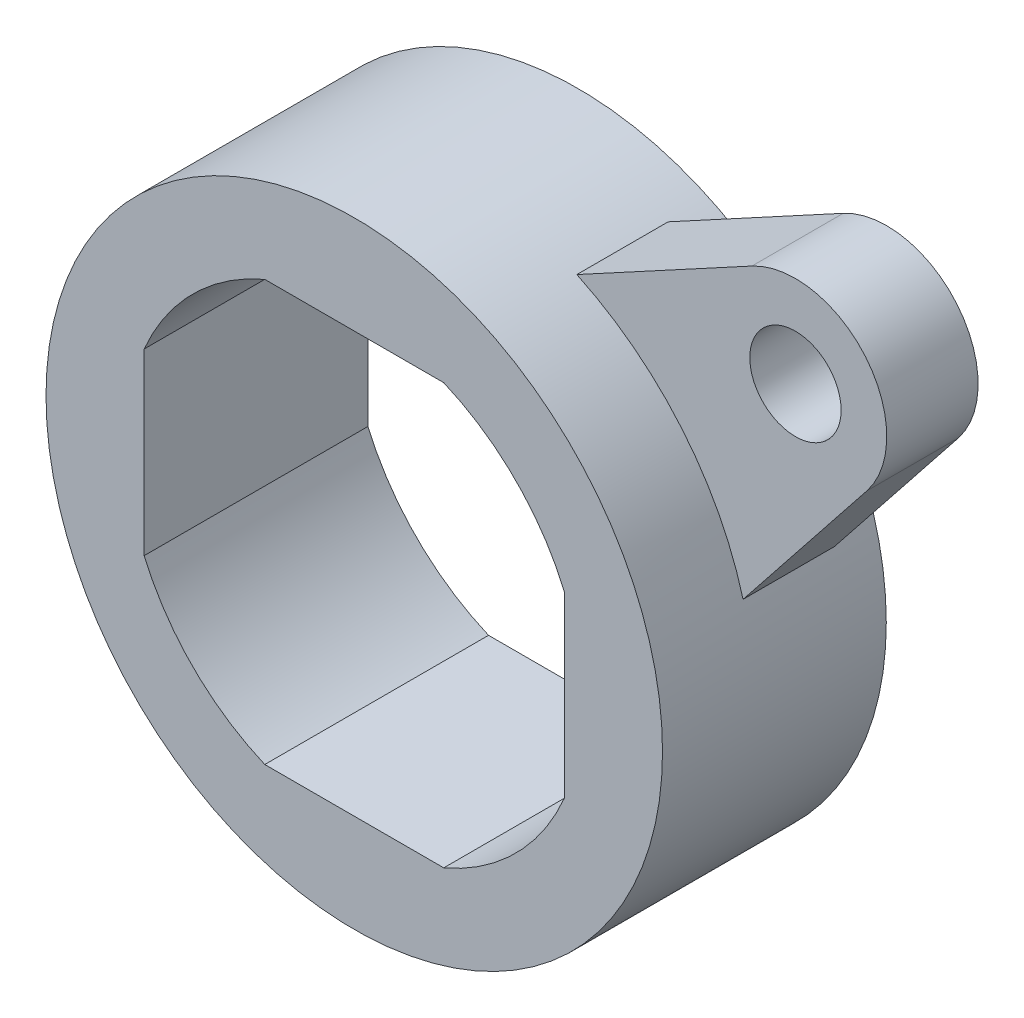
ISO-10303-21;
HEADER;
FILE_DESCRIPTION(('STEP AP214'),'2;1');
FILE_NAME('part.step','',(''),(''),'','','');
FILE_SCHEMA(('AUTOMOTIVE_DESIGN { 1 0 10303 214 1 1 1 1 }'));
ENDSEC;
DATA;
#1=APPLICATION_CONTEXT('core data for automotive mechanical design processes');
#2=APPLICATION_PROTOCOL_DEFINITION('international standard','automotive_design',2000,#1);
#3=PRODUCT_CONTEXT('',#1,'mechanical');
#4=PRODUCT('Part','Part','',(#3));
#5=PRODUCT_RELATED_PRODUCT_CATEGORY('part','',(#4));
#6=PRODUCT_DEFINITION_FORMATION('','',#4);
#7=PRODUCT_DEFINITION_CONTEXT('part definition',#1,'design');
#8=PRODUCT_DEFINITION('design','',#6,#7);
#9=PRODUCT_DEFINITION_SHAPE('','',#8);
#10=(LENGTH_UNIT() NAMED_UNIT(*) SI_UNIT(.MILLI.,.METRE.));
#11=(NAMED_UNIT(*) PLANE_ANGLE_UNIT() SI_UNIT($,.RADIAN.));
#12=(NAMED_UNIT(*) SI_UNIT($,.STERADIAN.) SOLID_ANGLE_UNIT());
#13=UNCERTAINTY_MEASURE_WITH_UNIT(LENGTH_MEASURE(1.E-05),#10,'distance_accuracy_value','');
#14=(GEOMETRIC_REPRESENTATION_CONTEXT(3) GLOBAL_UNCERTAINTY_ASSIGNED_CONTEXT((#13)) GLOBAL_UNIT_ASSIGNED_CONTEXT((#10,
#11,#12)) REPRESENTATION_CONTEXT('',''));
#15=CARTESIAN_POINT('',(0.,0.,0.));
#16=DIRECTION('',(0.,0.,1.));
#17=DIRECTION('',(1.,0.,0.));
#18=AXIS2_PLACEMENT_3D('',#15,#16,#17);
#19=CARTESIAN_POINT('',(0.,0.,27.));
#20=DIRECTION('',(0.,0.,1.));
#21=DIRECTION('',(1.,0.,0.));
#22=AXIS2_PLACEMENT_3D('',#19,#20,#21);
#23=PLANE('',#22);
#24=CARTESIAN_POINT('',(0.,0.,27.));
#25=DIRECTION('',(0.,0.,1.));
#26=DIRECTION('',(1.,0.,0.));
#27=AXIS2_PLACEMENT_3D('',#24,#25,#26);
#28=CIRCLE('',#27,6.75);
#29=CARTESIAN_POINT('',(6.75,0.,27.));
#30=VERTEX_POINT('',#29);
#31=EDGE_CURVE('E179',#30,#30,#28,.T.);
#32=ORIENTED_EDGE('',*,*,#31,.T.);
#33=EDGE_LOOP('',(#32));
#34=FACE_BOUND('',#33,.T.);
#35=CARTESIAN_POINT('',(0.,0.,27.));
#36=DIRECTION('',(0.,0.,1.));
#37=DIRECTION('',(1.,0.,0.));
#38=AXIS2_PLACEMENT_3D('',#35,#36,#37);
#39=CIRCLE('',#38,5.);
#40=CARTESIAN_POINT('',(4.6,1.95959179422654,27.));
#41=VERTEX_POINT('',#40);
#42=CARTESIAN_POINT('',(1.95959179422654,4.6,27.));
#43=VERTEX_POINT('',#42);
#44=EDGE_CURVE('E145',#41,#43,#39,.T.);
#45=ORIENTED_EDGE('',*,*,#44,.F.);
#46=DIRECTION('',(0.,-1.,0.));
#47=VECTOR('',#46,1.);
#48=CARTESIAN_POINT('',(4.6,0.,27.));
#49=LINE('',#48,#47);
#50=CARTESIAN_POINT('',(4.6,-1.95959179422654,27.));
#51=VERTEX_POINT('',#50);
#52=EDGE_CURVE('E130',#41,#51,#49,.T.);
#53=ORIENTED_EDGE('',*,*,#52,.T.);
#54=CARTESIAN_POINT('',(0.,0.,27.));
#55=DIRECTION('',(0.,0.,1.));
#56=DIRECTION('',(1.,0.,0.));
#57=AXIS2_PLACEMENT_3D('',#54,#55,#56);
#58=CIRCLE('',#57,5.);
#59=CARTESIAN_POINT('',(1.95959179422654,-4.6,27.));
#60=VERTEX_POINT('',#59);
#61=EDGE_CURVE('E138',#60,#51,#58,.T.);
#62=ORIENTED_EDGE('',*,*,#61,.F.);
#63=DIRECTION('',(-1.,0.,0.));
#64=VECTOR('',#63,1.);
#65=CARTESIAN_POINT('',(0.,-4.6,27.));
#66=LINE('',#65,#64);
#67=CARTESIAN_POINT('',(-1.95959179422654,-4.6,27.));
#68=VERTEX_POINT('',#67);
#69=EDGE_CURVE('E53',#60,#68,#66,.T.);
#70=ORIENTED_EDGE('',*,*,#69,.T.);
#71=CARTESIAN_POINT('',(0.,0.,27.));
#72=DIRECTION('',(0.,0.,1.));
#73=DIRECTION('',(1.,0.,0.));
#74=AXIS2_PLACEMENT_3D('',#71,#72,#73);
#75=CIRCLE('',#74,5.);
#76=CARTESIAN_POINT('',(-4.6,-1.95959179422654,27.));
#77=VERTEX_POINT('',#76);
#78=EDGE_CURVE('E159',#77,#68,#75,.T.);
#79=ORIENTED_EDGE('',*,*,#78,.F.);
#80=DIRECTION('',(0.,-1.,0.));
#81=VECTOR('',#80,1.);
#82=CARTESIAN_POINT('',(-4.6,0.,27.));
#83=LINE('',#82,#81);
#84=CARTESIAN_POINT('',(-4.6,1.95959179422655,27.));
#85=VERTEX_POINT('',#84);
#86=EDGE_CURVE('E156',#85,#77,#83,.T.);
#87=ORIENTED_EDGE('',*,*,#86,.F.);
#88=CARTESIAN_POINT('',(0.,0.,27.));
#89=DIRECTION('',(0.,0.,1.));
#90=DIRECTION('',(1.,0.,0.));
#91=AXIS2_PLACEMENT_3D('',#88,#89,#90);
#92=CIRCLE('',#91,5.);
#93=CARTESIAN_POINT('',(-1.95959179422654,4.6,27.));
#94=VERTEX_POINT('',#93);
#95=EDGE_CURVE('E153',#94,#85,#92,.T.);
#96=ORIENTED_EDGE('',*,*,#95,.F.);
#97=DIRECTION('',(-1.,0.,0.));
#98=VECTOR('',#97,1.);
#99=CARTESIAN_POINT('',(0.,4.6,27.));
#100=LINE('',#99,#98);
#101=EDGE_CURVE('E147',#43,#94,#100,.T.);
#102=ORIENTED_EDGE('',*,*,#101,.F.);
#103=EDGE_LOOP('',(#45,#53,#62,#70,#79,#87,#96,#102));
#104=FACE_BOUND('',#103,.T.);
#105=ADVANCED_FACE('F39',(#34,#104),#23,.T.);
#106=CARTESIAN_POINT('',(-11.07277942026,-15.,22.1));
#107=DIRECTION('',(0.,0.,1.));
#108=DIRECTION('',(1.,0.,0.));
#109=AXIS2_PLACEMENT_3D('',#106,#107,#108);
#110=PLANE('',#109);
#111=CARTESIAN_POINT('',(0.,0.,22.1));
#112=DIRECTION('',(0.,0.,1.));
#113=DIRECTION('',(1.,0.,0.));
#114=AXIS2_PLACEMENT_3D('',#111,#112,#113);
#115=CIRCLE('',#114,6.75);
#116=CARTESIAN_POINT('',(6.75,0.,22.1));
#117=VERTEX_POINT('',#116);
#118=EDGE_CURVE('E175',#117,#117,#115,.F.);
#119=ORIENTED_EDGE('',*,*,#118,.T.);
#120=EDGE_LOOP('',(#119));
#121=FACE_BOUND('',#120,.T.);
#122=DIRECTION('',(0.,1.,0.));
#123=VECTOR('',#122,1.);
#124=CARTESIAN_POINT('',(4.6,0.,22.1));
#125=LINE('',#124,#123);
#126=CARTESIAN_POINT('',(4.6,-1.95959179422654,22.1));
#127=VERTEX_POINT('',#126);
#128=CARTESIAN_POINT('',(4.6,1.95959179422654,22.1));
#129=VERTEX_POINT('',#128);
#130=EDGE_CURVE('E133',#127,#129,#125,.T.);
#131=ORIENTED_EDGE('',*,*,#130,.T.);
#132=CARTESIAN_POINT('',(0.,0.,22.1));
#133=DIRECTION('',(0.,0.,1.));
#134=DIRECTION('',(1.,0.,0.));
#135=AXIS2_PLACEMENT_3D('',#132,#133,#134);
#136=CIRCLE('',#135,5.);
#137=CARTESIAN_POINT('',(1.95959179422654,4.6,22.1));
#138=VERTEX_POINT('',#137);
#139=EDGE_CURVE('E267',#138,#129,#136,.F.);
#140=ORIENTED_EDGE('',*,*,#139,.F.);
#141=DIRECTION('',(1.,0.,0.));
#142=VECTOR('',#141,1.);
#143=CARTESIAN_POINT('',(0.,4.6,22.1));
#144=LINE('',#143,#142);
#145=CARTESIAN_POINT('',(-1.95959179422654,4.6,22.1));
#146=VERTEX_POINT('',#145);
#147=EDGE_CURVE('E270',#146,#138,#144,.T.);
#148=ORIENTED_EDGE('',*,*,#147,.F.);
#149=CARTESIAN_POINT('',(0.,0.,22.1));
#150=DIRECTION('',(0.,0.,1.));
#151=DIRECTION('',(1.,0.,0.));
#152=AXIS2_PLACEMENT_3D('',#149,#150,#151);
#153=CIRCLE('',#152,5.);
#154=CARTESIAN_POINT('',(-4.6,1.95959179422655,22.1));
#155=VERTEX_POINT('',#154);
#156=EDGE_CURVE('E274',#155,#146,#153,.F.);
#157=ORIENTED_EDGE('',*,*,#156,.F.);
#158=DIRECTION('',(0.,1.,0.));
#159=VECTOR('',#158,1.);
#160=CARTESIAN_POINT('',(-4.6,0.,22.1));
#161=LINE('',#160,#159);
#162=CARTESIAN_POINT('',(-4.6,-1.95959179422654,22.1));
#163=VERTEX_POINT('',#162);
#164=EDGE_CURVE('E276',#163,#155,#161,.T.);
#165=ORIENTED_EDGE('',*,*,#164,.F.);
#166=CARTESIAN_POINT('',(0.,0.,22.1));
#167=DIRECTION('',(0.,0.,1.));
#168=DIRECTION('',(1.,0.,0.));
#169=AXIS2_PLACEMENT_3D('',#166,#167,#168);
#170=CIRCLE('',#169,5.);
#171=CARTESIAN_POINT('',(-1.95959179422654,-4.6,22.1));
#172=VERTEX_POINT('',#171);
#173=EDGE_CURVE('E278',#172,#163,#170,.F.);
#174=ORIENTED_EDGE('',*,*,#173,.F.);
#175=DIRECTION('',(1.,0.,0.));
#176=VECTOR('',#175,1.);
#177=CARTESIAN_POINT('',(0.,-4.6,22.1));
#178=LINE('',#177,#176);
#179=CARTESIAN_POINT('',(1.95959179422654,-4.6,22.1));
#180=VERTEX_POINT('',#179);
#181=EDGE_CURVE('E280',#172,#180,#178,.T.);
#182=ORIENTED_EDGE('',*,*,#181,.T.);
#183=CARTESIAN_POINT('',(0.,0.,22.1));
#184=DIRECTION('',(0.,0.,1.));
#185=DIRECTION('',(1.,0.,0.));
#186=AXIS2_PLACEMENT_3D('',#183,#184,#185);
#187=CIRCLE('',#186,5.);
#188=EDGE_CURVE('E182',#127,#180,#187,.F.);
#189=ORIENTED_EDGE('',*,*,#188,.F.);
#190=EDGE_LOOP('',(#131,#140,#148,#157,#165,#174,#182,#189));
#191=FACE_BOUND('',#190,.T.);
#192=ADVANCED_FACE('F252',(#121,#191),#110,.F.);
#193=CARTESIAN_POINT('',(0.,0.,3.00811690796322));
#194=DIRECTION('',(0.,0.,1.));
#195=DIRECTION('',(1.,0.,0.));
#196=AXIS2_PLACEMENT_3D('',#193,#194,#195);
#197=CYLINDRICAL_SURFACE('',#196,6.75);
#198=ORIENTED_EDGE('',*,*,#31,.F.);
#199=EDGE_LOOP('',(#198));
#200=FACE_BOUND('',#199,.T.);
#201=ORIENTED_EDGE('',*,*,#118,.F.);
#202=EDGE_LOOP('',(#201));
#203=FACE_BOUND('',#202,.T.);
#204=CARTESIAN_POINT('',(0.,0.,23.));
#205=DIRECTION('',(0.,0.,1.));
#206=DIRECTION('',(1.,0.,0.));
#207=AXIS2_PLACEMENT_3D('',#204,#205,#206);
#208=CIRCLE('',#207,6.75);
#209=CARTESIAN_POINT('',(6.51399241221891,1.76929445077819,23.));
#210=VERTEX_POINT('',#209);
#211=CARTESIAN_POINT('',(2.87355780420598,6.10779547348197,23.));
#212=VERTEX_POINT('',#211);
#213=EDGE_CURVE('E187',#210,#212,#208,.T.);
#214=ORIENTED_EDGE('',*,*,#213,.F.);
#215=DIRECTION('',(0.,0.,1.));
#216=VECTOR('',#215,1.);
#217=CARTESIAN_POINT('',(6.51399241221891,1.76929445077819,3.00811690796322));
#218=LINE('',#217,#216);
#219=CARTESIAN_POINT('',(6.51399241221891,1.76929445077819,25.));
#220=VERTEX_POINT('',#219);
#221=EDGE_CURVE('E178',#220,#210,#218,.F.);
#222=ORIENTED_EDGE('',*,*,#221,.F.);
#223=CARTESIAN_POINT('',(0.,0.,25.));
#224=DIRECTION('',(0.,0.,1.));
#225=DIRECTION('',(1.,0.,0.));
#226=AXIS2_PLACEMENT_3D('',#223,#224,#225);
#227=CIRCLE('',#226,6.75);
#228=CARTESIAN_POINT('',(2.87355780420598,6.10779547348197,25.));
#229=VERTEX_POINT('',#228);
#230=EDGE_CURVE('E11',#220,#229,#227,.T.);
#231=ORIENTED_EDGE('',*,*,#230,.T.);
#232=DIRECTION('',(0.,0.,1.));
#233=VECTOR('',#232,1.);
#234=CARTESIAN_POINT('',(2.87355780420598,6.10779547348197,3.00811690796322));
#235=LINE('',#234,#233);
#236=EDGE_CURVE('E184',#229,#212,#235,.F.);
#237=ORIENTED_EDGE('',*,*,#236,.T.);
#238=EDGE_LOOP('',(#214,#222,#231,#237));
#239=FACE_BOUND('',#238,.T.);
#240=ADVANCED_FACE('F232',(#200,#203,#239),#197,.T.);
#241=CARTESIAN_POINT('',(7.66044443118984,6.42787609686532,23.));
#242=DIRECTION('',(0.,0.,1.));
#243=DIRECTION('',(1.,0.,0.));
#244=AXIS2_PLACEMENT_3D('',#241,#242,#243);
#245=CYLINDRICAL_SURFACE('',#244,1.);
#246=CARTESIAN_POINT('',(7.66044443118984,6.42787609686532,23.));
#247=DIRECTION('',(0.,0.,1.));
#248=DIRECTION('',(1.,0.,0.));
#249=AXIS2_PLACEMENT_3D('',#246,#247,#248);
#250=CIRCLE('',#249,1.);
#251=CARTESIAN_POINT('',(8.66044443118984,6.42787609686532,23.));
#252=VERTEX_POINT('',#251);
#253=EDGE_CURVE('E200',#252,#252,#250,.T.);
#254=ORIENTED_EDGE('',*,*,#253,.F.);
#255=EDGE_LOOP('',(#254));
#256=FACE_BOUND('',#255,.T.);
#257=CARTESIAN_POINT('',(7.66044443118984,6.42787609686532,25.));
#258=DIRECTION('',(0.,0.,1.));
#259=DIRECTION('',(1.,0.,0.));
#260=AXIS2_PLACEMENT_3D('',#257,#258,#259);
#261=CIRCLE('',#260,1.);
#262=CARTESIAN_POINT('',(8.66044443118984,6.42787609686532,25.));
#263=VERTEX_POINT('',#262);
#264=EDGE_CURVE('E194',#263,#263,#261,.T.);
#265=ORIENTED_EDGE('',*,*,#264,.T.);
#266=EDGE_LOOP('',(#265));
#267=FACE_BOUND('',#266,.T.);
#268=ADVANCED_FACE('F240',(#256,#267),#245,.F.);
#269=CARTESIAN_POINT('',(7.66044443118984,6.42787609686532,23.));
#270=DIRECTION('',(0.,0.,1.));
#271=DIRECTION('',(1.,0.,0.));
#272=AXIS2_PLACEMENT_3D('',#269,#270,#271);
#273=CYLINDRICAL_SURFACE('',#272,2.);
#274=CARTESIAN_POINT('',(7.66044443118984,6.42787609686532,25.));
#275=DIRECTION('',(0.,0.,1.));
#276=DIRECTION('',(1.,0.,0.));
#277=AXIS2_PLACEMENT_3D('',#274,#275,#276);
#278=CIRCLE('',#277,2.);
#279=CARTESIAN_POINT('',(9.22646353380965,5.18385673599113,25.));
#280=VERTEX_POINT('',#279);
#281=CARTESIAN_POINT('',(6.70726088306521,8.18612554548874,25.));
#282=VERTEX_POINT('',#281);
#283=EDGE_CURVE('E206',#280,#282,#278,.T.);
#284=ORIENTED_EDGE('',*,*,#283,.F.);
#285=DIRECTION('',(0.,0.,1.));
#286=VECTOR('',#285,1.);
#287=CARTESIAN_POINT('',(9.22646353380965,5.18385673599113,23.));
#288=LINE('',#287,#286);
#289=CARTESIAN_POINT('',(9.22646353380965,5.18385673599113,23.));
#290=VERTEX_POINT('',#289);
#291=EDGE_CURVE('E203',#290,#280,#288,.T.);
#292=ORIENTED_EDGE('',*,*,#291,.F.);
#293=CARTESIAN_POINT('',(7.66044443118984,6.42787609686532,23.));
#294=DIRECTION('',(0.,0.,1.));
#295=DIRECTION('',(1.,0.,0.));
#296=AXIS2_PLACEMENT_3D('',#293,#294,#295);
#297=CIRCLE('',#296,2.);
#298=CARTESIAN_POINT('',(6.70726088306521,8.18612554548874,23.));
#299=VERTEX_POINT('',#298);
#300=EDGE_CURVE('E193',#290,#299,#297,.T.);
#301=ORIENTED_EDGE('',*,*,#300,.T.);
#302=DIRECTION('',(0.,0.,1.));
#303=VECTOR('',#302,1.);
#304=CARTESIAN_POINT('',(6.70726088306521,8.18612554548874,23.));
#305=LINE('',#304,#303);
#306=EDGE_CURVE('E46',#299,#282,#305,.T.);
#307=ORIENTED_EDGE('',*,*,#306,.T.);
#308=EDGE_LOOP('',(#284,#292,#301,#307));
#309=FACE_BOUND('',#308,.T.);
#310=ADVANCED_FACE('F225',(#309),#273,.T.);
#311=CARTESIAN_POINT('',(0.,0.,23.));
#312=DIRECTION('',(0.,0.,1.));
#313=DIRECTION('',(1.,0.,0.));
#314=AXIS2_PLACEMENT_3D('',#311,#312,#313);
#315=PLANE('',#314);
#316=DIRECTION('',(-0.622009680437095,-0.783009551309908,0.));
#317=VECTOR('',#316,1.);
#318=CARTESIAN_POINT('',(3.13203820523963,-2.48803872174838,23.));
#319=LINE('',#318,#317);
#320=EDGE_CURVE('E190',#290,#210,#319,.T.);
#321=ORIENTED_EDGE('',*,*,#320,.T.);
#322=ORIENTED_EDGE('',*,*,#213,.T.);
#323=DIRECTION('',(-0.879124724311708,-0.476591774062315,0.));
#324=VECTOR('',#323,1.);
#325=CARTESIAN_POINT('',(-1.90636709624926,3.51649889724683,23.));
#326=LINE('',#325,#324);
#327=EDGE_CURVE('E197',#299,#212,#326,.T.);
#328=ORIENTED_EDGE('',*,*,#327,.F.);
#329=ORIENTED_EDGE('',*,*,#300,.F.);
#330=EDGE_LOOP('',(#321,#322,#328,#329));
#331=FACE_BOUND('',#330,.T.);
#332=ORIENTED_EDGE('',*,*,#253,.T.);
#333=EDGE_LOOP('',(#332));
#334=FACE_BOUND('',#333,.T.);
#335=ADVANCED_FACE('F234',(#331,#334),#315,.F.);
#336=CARTESIAN_POINT('',(0.,0.,25.));
#337=DIRECTION('',(0.,0.,1.));
#338=DIRECTION('',(1.,0.,0.));
#339=AXIS2_PLACEMENT_3D('',#336,#337,#338);
#340=PLANE('',#339);
#341=ORIENTED_EDGE('',*,*,#230,.F.);
#342=DIRECTION('',(-0.622009680437095,-0.783009551309908,0.));
#343=VECTOR('',#342,1.);
#344=CARTESIAN_POINT('',(3.13203820523963,-2.48803872174838,25.));
#345=LINE('',#344,#343);
#346=EDGE_CURVE('E189',#280,#220,#345,.T.);
#347=ORIENTED_EDGE('',*,*,#346,.F.);
#348=ORIENTED_EDGE('',*,*,#283,.T.);
#349=DIRECTION('',(-0.879124724311708,-0.476591774062315,0.));
#350=VECTOR('',#349,1.);
#351=CARTESIAN_POINT('',(-1.90636709624926,3.51649889724683,25.));
#352=LINE('',#351,#350);
#353=EDGE_CURVE('E209',#282,#229,#352,.T.);
#354=ORIENTED_EDGE('',*,*,#353,.T.);
#355=EDGE_LOOP('',(#341,#347,#348,#354));
#356=FACE_BOUND('',#355,.T.);
#357=ORIENTED_EDGE('',*,*,#264,.F.);
#358=EDGE_LOOP('',(#357));
#359=FACE_BOUND('',#358,.T.);
#360=ADVANCED_FACE('F222',(#356,#359),#340,.T.);
#361=CARTESIAN_POINT('',(3.13203820523963,-2.48803872174838,23.));
#362=DIRECTION('',(-0.783009551309908,0.622009680437095,0.));
#363=DIRECTION('',(-0.622009680437095,-0.783009551309908,0.));
#364=AXIS2_PLACEMENT_3D('',#361,#362,#363);
#365=PLANE('',#364);
#366=ORIENTED_EDGE('',*,*,#346,.T.);
#367=ORIENTED_EDGE('',*,*,#221,.T.);
#368=ORIENTED_EDGE('',*,*,#320,.F.);
#369=ORIENTED_EDGE('',*,*,#291,.T.);
#370=EDGE_LOOP('',(#366,#367,#368,#369));
#371=FACE_BOUND('',#370,.T.);
#372=ADVANCED_FACE('F216',(#371),#365,.F.);
#373=CARTESIAN_POINT('',(-1.90636709624926,3.51649889724683,23.));
#374=DIRECTION('',(-0.476591774062315,0.879124724311708,0.));
#375=DIRECTION('',(-0.879124724311708,-0.476591774062315,0.));
#376=AXIS2_PLACEMENT_3D('',#373,#374,#375);
#377=PLANE('',#376);
#378=ORIENTED_EDGE('',*,*,#236,.F.);
#379=ORIENTED_EDGE('',*,*,#353,.F.);
#380=ORIENTED_EDGE('',*,*,#306,.F.);
#381=ORIENTED_EDGE('',*,*,#327,.T.);
#382=EDGE_LOOP('',(#378,#379,#380,#381));
#383=FACE_BOUND('',#382,.T.);
#384=ADVANCED_FACE('F229',(#383),#377,.T.);
#385=CARTESIAN_POINT('',(4.6,0.,9.08923522616752));
#386=DIRECTION('',(-1.,0.,0.));
#387=DIRECTION('',(0.,0.,1.));
#388=AXIS2_PLACEMENT_3D('',#385,#386,#387);
#389=PLANE('',#388);
#390=DIRECTION('',(0.,0.,1.));
#391=VECTOR('',#390,1.);
#392=CARTESIAN_POINT('',(4.6,-1.95959179422654,9.08923522616752));
#393=LINE('',#392,#391);
#394=EDGE_CURVE('E61',#127,#51,#393,.T.);
#395=ORIENTED_EDGE('',*,*,#394,.T.);
#396=ORIENTED_EDGE('',*,*,#52,.F.);
#397=DIRECTION('',(0.,0.,1.));
#398=VECTOR('',#397,1.);
#399=CARTESIAN_POINT('',(4.6,1.95959179422654,9.08923522616752));
#400=LINE('',#399,#398);
#401=EDGE_CURVE('E135',#129,#41,#400,.T.);
#402=ORIENTED_EDGE('',*,*,#401,.F.);
#403=ORIENTED_EDGE('',*,*,#130,.F.);
#404=EDGE_LOOP('',(#395,#396,#402,#403));
#405=FACE_BOUND('',#404,.T.);
#406=ADVANCED_FACE('F127',(#405),#389,.T.);
#407=CARTESIAN_POINT('',(0.,0.,9.08923522616752));
#408=DIRECTION('',(0.,0.,1.));
#409=DIRECTION('',(1.,0.,0.));
#410=AXIS2_PLACEMENT_3D('',#407,#408,#409);
#411=CYLINDRICAL_SURFACE('',#410,5.);
#412=ORIENTED_EDGE('',*,*,#139,.T.);
#413=ORIENTED_EDGE('',*,*,#401,.T.);
#414=ORIENTED_EDGE('',*,*,#44,.T.);
#415=DIRECTION('',(0.,0.,1.));
#416=VECTOR('',#415,1.);
#417=CARTESIAN_POINT('',(1.95959179422654,4.6,9.08923522616752));
#418=LINE('',#417,#416);
#419=EDGE_CURVE('E172',#138,#43,#418,.T.);
#420=ORIENTED_EDGE('',*,*,#419,.F.);
#421=EDGE_LOOP('',(#412,#413,#414,#420));
#422=FACE_BOUND('',#421,.T.);
#423=ADVANCED_FACE('F302',(#422),#411,.F.);
#424=CARTESIAN_POINT('',(0.,4.6,9.08923522616752));
#425=DIRECTION('',(0.,1.,0.));
#426=DIRECTION('',(0.,0.,1.));
#427=AXIS2_PLACEMENT_3D('',#424,#425,#426);
#428=PLANE('',#427);
#429=ORIENTED_EDGE('',*,*,#147,.T.);
#430=ORIENTED_EDGE('',*,*,#419,.T.);
#431=ORIENTED_EDGE('',*,*,#101,.T.);
#432=DIRECTION('',(0.,0.,1.));
#433=VECTOR('',#432,1.);
#434=CARTESIAN_POINT('',(-1.95959179422654,4.6,9.08923522616752));
#435=LINE('',#434,#433);
#436=EDGE_CURVE('E170',#146,#94,#435,.T.);
#437=ORIENTED_EDGE('',*,*,#436,.F.);
#438=EDGE_LOOP('',(#429,#430,#431,#437));
#439=FACE_BOUND('',#438,.T.);
#440=ADVANCED_FACE('F299',(#439),#428,.F.);
#441=CARTESIAN_POINT('',(0.,0.,9.08923522616752));
#442=DIRECTION('',(0.,0.,1.));
#443=DIRECTION('',(1.,0.,0.));
#444=AXIS2_PLACEMENT_3D('',#441,#442,#443);
#445=CYLINDRICAL_SURFACE('',#444,5.);
#446=ORIENTED_EDGE('',*,*,#156,.T.);
#447=ORIENTED_EDGE('',*,*,#436,.T.);
#448=ORIENTED_EDGE('',*,*,#95,.T.);
#449=DIRECTION('',(0.,0.,1.));
#450=VECTOR('',#449,1.);
#451=CARTESIAN_POINT('',(-4.6,1.95959179422655,9.08923522616752));
#452=LINE('',#451,#450);
#453=EDGE_CURVE('E168',#155,#85,#452,.T.);
#454=ORIENTED_EDGE('',*,*,#453,.F.);
#455=EDGE_LOOP('',(#446,#447,#448,#454));
#456=FACE_BOUND('',#455,.T.);
#457=ADVANCED_FACE('F296',(#456),#445,.F.);
#458=CARTESIAN_POINT('',(-4.6,0.,9.08923522616752));
#459=DIRECTION('',(-1.,0.,0.));
#460=DIRECTION('',(0.,0.,1.));
#461=AXIS2_PLACEMENT_3D('',#458,#459,#460);
#462=PLANE('',#461);
#463=ORIENTED_EDGE('',*,*,#164,.T.);
#464=ORIENTED_EDGE('',*,*,#453,.T.);
#465=ORIENTED_EDGE('',*,*,#86,.T.);
#466=DIRECTION('',(0.,0.,1.));
#467=VECTOR('',#466,1.);
#468=CARTESIAN_POINT('',(-4.6,-1.95959179422654,9.08923522616752));
#469=LINE('',#468,#467);
#470=EDGE_CURVE('E166',#163,#77,#469,.T.);
#471=ORIENTED_EDGE('',*,*,#470,.F.);
#472=EDGE_LOOP('',(#463,#464,#465,#471));
#473=FACE_BOUND('',#472,.T.);
#474=ADVANCED_FACE('F290',(#473),#462,.F.);
#475=CARTESIAN_POINT('',(0.,0.,9.08923522616752));
#476=DIRECTION('',(0.,0.,1.));
#477=DIRECTION('',(1.,0.,0.));
#478=AXIS2_PLACEMENT_3D('',#475,#476,#477);
#479=CYLINDRICAL_SURFACE('',#478,5.);
#480=ORIENTED_EDGE('',*,*,#173,.T.);
#481=ORIENTED_EDGE('',*,*,#470,.T.);
#482=ORIENTED_EDGE('',*,*,#78,.T.);
#483=DIRECTION('',(0.,0.,1.));
#484=VECTOR('',#483,1.);
#485=CARTESIAN_POINT('',(-1.95959179422654,-4.6,9.08923522616752));
#486=LINE('',#485,#484);
#487=EDGE_CURVE('E164',#172,#68,#486,.T.);
#488=ORIENTED_EDGE('',*,*,#487,.F.);
#489=EDGE_LOOP('',(#480,#481,#482,#488));
#490=FACE_BOUND('',#489,.T.);
#491=ADVANCED_FACE('F288',(#490),#479,.F.);
#492=CARTESIAN_POINT('',(0.,-4.6,9.08923522616752));
#493=DIRECTION('',(0.,1.,0.));
#494=DIRECTION('',(0.,0.,1.));
#495=AXIS2_PLACEMENT_3D('',#492,#493,#494);
#496=PLANE('',#495);
#497=ORIENTED_EDGE('',*,*,#487,.T.);
#498=ORIENTED_EDGE('',*,*,#69,.F.);
#499=DIRECTION('',(0.,0.,1.));
#500=VECTOR('',#499,1.);
#501=CARTESIAN_POINT('',(1.95959179422654,-4.6,9.08923522616752));
#502=LINE('',#501,#500);
#503=EDGE_CURVE('E140',#180,#60,#502,.T.);
#504=ORIENTED_EDGE('',*,*,#503,.F.);
#505=ORIENTED_EDGE('',*,*,#181,.F.);
#506=EDGE_LOOP('',(#497,#498,#504,#505));
#507=FACE_BOUND('',#506,.T.);
#508=ADVANCED_FACE('F281',(#507),#496,.T.);
#509=CARTESIAN_POINT('',(0.,0.,9.08923522616752));
#510=DIRECTION('',(0.,0.,1.));
#511=DIRECTION('',(1.,0.,0.));
#512=AXIS2_PLACEMENT_3D('',#509,#510,#511);
#513=CYLINDRICAL_SURFACE('',#512,5.);
#514=ORIENTED_EDGE('',*,*,#188,.T.);
#515=ORIENTED_EDGE('',*,*,#503,.T.);
#516=ORIENTED_EDGE('',*,*,#61,.T.);
#517=ORIENTED_EDGE('',*,*,#394,.F.);
#518=EDGE_LOOP('',(#514,#515,#516,#517));
#519=FACE_BOUND('',#518,.T.);
#520=ADVANCED_FACE('F139',(#519),#513,.F.);
#521=CLOSED_SHELL('',(#105,#192,#240,#268,#310,#335,#360,#372,#384,#406,#423,#440,#457,#474,
#491,#508,#520));
#522=MANIFOLD_SOLID_BREP('B2',#521);
#523=ADVANCED_BREP_SHAPE_REPRESENTATION('',(#18,#522),#14);
#524=SHAPE_DEFINITION_REPRESENTATION(#9,#523);
ENDSEC;
END-ISO-10303-21;
